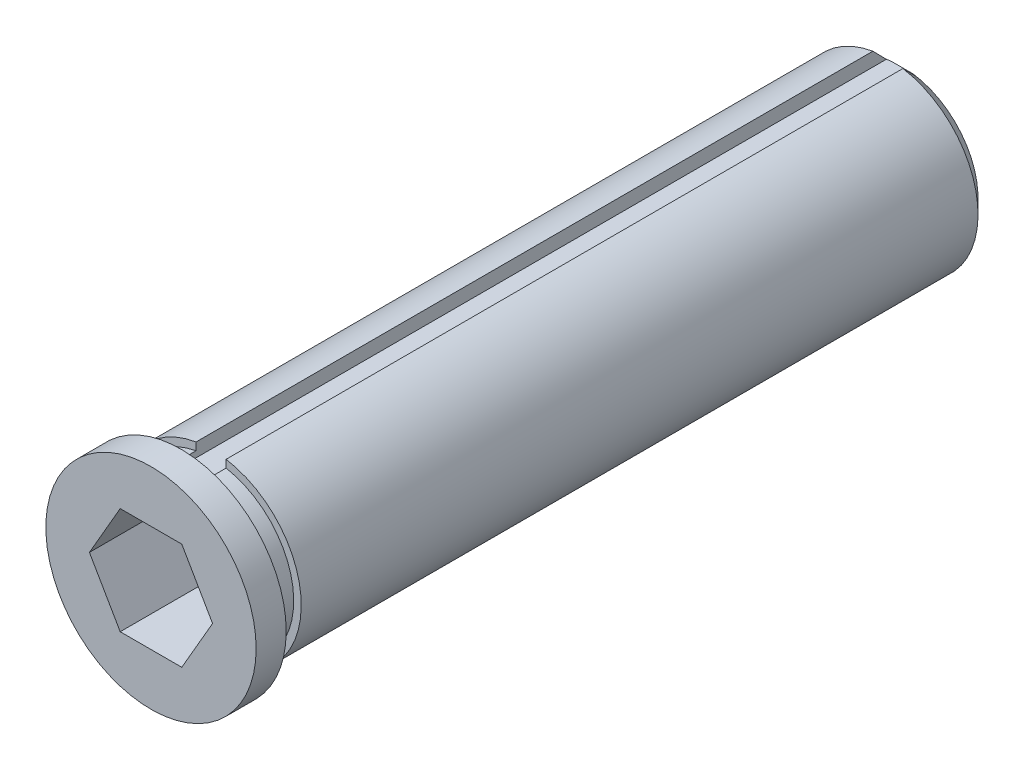
ISO-10303-21;
HEADER;
FILE_DESCRIPTION(('STEP AP214'),'2;1');
FILE_NAME('part.step','',(''),(''),'','','');
FILE_SCHEMA(('AUTOMOTIVE_DESIGN { 1 0 10303 214 1 1 1 1 }'));
ENDSEC;
DATA;
#1=APPLICATION_CONTEXT('core data for automotive mechanical design processes');
#2=APPLICATION_PROTOCOL_DEFINITION('international standard','automotive_design',2000,#1);
#3=PRODUCT_CONTEXT('',#1,'mechanical');
#4=PRODUCT('Part','Part','',(#3));
#5=PRODUCT_RELATED_PRODUCT_CATEGORY('part','',(#4));
#6=PRODUCT_DEFINITION_FORMATION('','',#4);
#7=PRODUCT_DEFINITION_CONTEXT('part definition',#1,'design');
#8=PRODUCT_DEFINITION('design','',#6,#7);
#9=PRODUCT_DEFINITION_SHAPE('','',#8);
#10=(LENGTH_UNIT() NAMED_UNIT(*) SI_UNIT(.MILLI.,.METRE.));
#11=(NAMED_UNIT(*) PLANE_ANGLE_UNIT() SI_UNIT($,.RADIAN.));
#12=(NAMED_UNIT(*) SI_UNIT($,.STERADIAN.) SOLID_ANGLE_UNIT());
#13=UNCERTAINTY_MEASURE_WITH_UNIT(LENGTH_MEASURE(1.E-05),#10,'distance_accuracy_value','');
#14=(GEOMETRIC_REPRESENTATION_CONTEXT(3) GLOBAL_UNCERTAINTY_ASSIGNED_CONTEXT((#13)) GLOBAL_UNIT_ASSIGNED_CONTEXT((#10,
#11,#12)) REPRESENTATION_CONTEXT('',''));
#15=CARTESIAN_POINT('',(0.,0.,0.));
#16=DIRECTION('',(0.,0.,1.));
#17=DIRECTION('',(1.,0.,0.));
#18=AXIS2_PLACEMENT_3D('',#15,#16,#17);
#19=CARTESIAN_POINT('',(0.,0.,0.));
#20=DIRECTION('',(0.,0.,1.));
#21=DIRECTION('',(1.,0.,0.));
#22=AXIS2_PLACEMENT_3D('',#19,#20,#21);
#23=PLANE('',#22);
#24=DIRECTION('',(0.5,0.866025403784439,0.));
#25=VECTOR('',#24,1.);
#26=CARTESIAN_POINT('',(2.04959345562317,-3.55,0.));
#27=LINE('',#26,#25);
#28=CARTESIAN_POINT('',(2.04959345562317,-3.55,0.));
#29=VERTEX_POINT('',#28);
#30=CARTESIAN_POINT('',(4.09918691124634,0.,0.));
#31=VERTEX_POINT('',#30);
#32=EDGE_CURVE('E229',#29,#31,#27,.T.);
#33=ORIENTED_EDGE('',*,*,#32,.T.);
#34=DIRECTION('',(-0.5,0.866025403784439,0.));
#35=VECTOR('',#34,1.);
#36=CARTESIAN_POINT('',(4.09918691124634,0.,0.));
#37=LINE('',#36,#35);
#38=CARTESIAN_POINT('',(2.04959345562317,3.55,0.));
#39=VERTEX_POINT('',#38);
#40=EDGE_CURVE('E257',#31,#39,#37,.T.);
#41=ORIENTED_EDGE('',*,*,#40,.T.);
#42=DIRECTION('',(-1.,0.,0.));
#43=VECTOR('',#42,1.);
#44=CARTESIAN_POINT('',(2.04959345562317,3.55,0.));
#45=LINE('',#44,#43);
#46=CARTESIAN_POINT('',(-2.04959345562317,3.55,0.));
#47=VERTEX_POINT('',#46);
#48=EDGE_CURVE('E261',#39,#47,#45,.T.);
#49=ORIENTED_EDGE('',*,*,#48,.T.);
#50=DIRECTION('',(-0.5,-0.866025403784439,0.));
#51=VECTOR('',#50,1.);
#52=CARTESIAN_POINT('',(-2.04959345562317,3.55,0.));
#53=LINE('',#52,#51);
#54=CARTESIAN_POINT('',(-4.09918691124634,0.,0.));
#55=VERTEX_POINT('',#54);
#56=EDGE_CURVE('E265',#47,#55,#53,.T.);
#57=ORIENTED_EDGE('',*,*,#56,.T.);
#58=DIRECTION('',(0.5,-0.866025403784439,0.));
#59=VECTOR('',#58,1.);
#60=CARTESIAN_POINT('',(-4.09918691124634,0.,0.));
#61=LINE('',#60,#59);
#62=CARTESIAN_POINT('',(-2.04959345562317,-3.55,0.));
#63=VERTEX_POINT('',#62);
#64=EDGE_CURVE('E269',#55,#63,#61,.T.);
#65=ORIENTED_EDGE('',*,*,#64,.T.);
#66=DIRECTION('',(1.,0.,0.));
#67=VECTOR('',#66,1.);
#68=CARTESIAN_POINT('',(-2.04959345562317,-3.55,0.));
#69=LINE('',#68,#67);
#70=EDGE_CURVE('E238',#63,#29,#69,.T.);
#71=ORIENTED_EDGE('',*,*,#70,.T.);
#72=EDGE_LOOP('',(#33,#41,#49,#57,#65,#71));
#73=FACE_BOUND('',#72,.T.);
#74=CARTESIAN_POINT('',(0.,0.,0.));
#75=DIRECTION('',(0.,0.,1.));
#76=DIRECTION('',(1.,0.,0.));
#77=AXIS2_PLACEMENT_3D('',#74,#75,#76);
#78=CIRCLE('',#77,5.053);
#79=CARTESIAN_POINT('',(-0.729937668571788,5.,0.));
#80=VERTEX_POINT('',#79);
#81=CARTESIAN_POINT('',(0.729937668571798,5.,0.));
#82=VERTEX_POINT('',#81);
#83=EDGE_CURVE('E209',#80,#82,#78,.T.);
#84=ORIENTED_EDGE('',*,*,#83,.F.);
#85=DIRECTION('',(1.,0.,0.));
#86=VECTOR('',#85,1.);
#87=CARTESIAN_POINT('',(0.,5.,0.));
#88=LINE('',#87,#86);
#89=EDGE_CURVE('E205',#80,#82,#88,.T.);
#90=ORIENTED_EDGE('',*,*,#89,.T.);
#91=EDGE_LOOP('',(#84,#90));
#92=FACE_BOUND('',#91,.T.);
#93=ADVANCED_FACE('F52',(#73,#92),#23,.F.);
#94=CARTESIAN_POINT('',(0.,0.,50.));
#95=DIRECTION('',(0.,0.,-1.));
#96=DIRECTION('',(-1.,0.,0.));
#97=AXIS2_PLACEMENT_3D('',#94,#95,#96);
#98=CYLINDRICAL_SURFACE('',#97,6.);
#99=CARTESIAN_POINT('',(0.,0.,46.));
#100=DIRECTION('',(0.,0.,-1.));
#101=DIRECTION('',(-1.,0.,0.));
#102=AXIS2_PLACEMENT_3D('',#99,#100,#101);
#103=CIRCLE('',#102,6.);
#104=CARTESIAN_POINT('',(1.,5.91607978309962,46.));
#105=VERTEX_POINT('',#104);
#106=CARTESIAN_POINT('',(-1.,5.91607978309962,46.));
#107=VERTEX_POINT('',#106);
#108=EDGE_CURVE('E222',#105,#107,#103,.T.);
#109=ORIENTED_EDGE('',*,*,#108,.T.);
#110=DIRECTION('',(0.,0.,-1.));
#111=VECTOR('',#110,1.);
#112=CARTESIAN_POINT('',(-1.,5.91607978309962,50.));
#113=LINE('',#112,#111);
#114=CARTESIAN_POINT('',(-1.,5.91607978309962,0.94699999999999));
#115=VERTEX_POINT('',#114);
#116=EDGE_CURVE('E195',#107,#115,#113,.T.);
#117=ORIENTED_EDGE('',*,*,#116,.T.);
#118=CARTESIAN_POINT('',(0.,0.,0.94699999999999));
#119=DIRECTION('',(0.,0.,1.));
#120=DIRECTION('',(1.,0.,0.));
#121=AXIS2_PLACEMENT_3D('',#118,#119,#120);
#122=CIRCLE('',#121,6.);
#123=CARTESIAN_POINT('',(1.,5.91607978309962,0.94699999999999));
#124=VERTEX_POINT('',#123);
#125=EDGE_CURVE('E213',#115,#124,#122,.T.);
#126=ORIENTED_EDGE('',*,*,#125,.T.);
#127=DIRECTION('',(0.,0.,-1.));
#128=VECTOR('',#127,1.);
#129=CARTESIAN_POINT('',(1.,5.91607978309962,50.));
#130=LINE('',#129,#128);
#131=EDGE_CURVE('E75',#105,#124,#130,.T.);
#132=ORIENTED_EDGE('',*,*,#131,.F.);
#133=EDGE_LOOP('',(#109,#117,#126,#132));
#134=FACE_BOUND('',#133,.T.);
#135=ADVANCED_FACE('F54',(#134),#98,.T.);
#136=CARTESIAN_POINT('',(0.,0.,50.));
#137=DIRECTION('',(0.,0.,1.));
#138=DIRECTION('',(1.,0.,0.));
#139=AXIS2_PLACEMENT_3D('',#136,#137,#138);
#140=PLANE('',#139);
#141=DIRECTION('',(-0.5,0.866025403784439,0.));
#142=VECTOR('',#141,1.);
#143=CARTESIAN_POINT('',(4.09918691124634,0.,50.));
#144=LINE('',#143,#142);
#145=CARTESIAN_POINT('',(4.09918691124634,0.,50.));
#146=VERTEX_POINT('',#145);
#147=CARTESIAN_POINT('',(2.04959345562317,3.55,50.));
#148=VERTEX_POINT('',#147);
#149=EDGE_CURVE('E237',#146,#148,#144,.T.);
#150=ORIENTED_EDGE('',*,*,#149,.F.);
#151=DIRECTION('',(0.5,0.866025403784439,0.));
#152=VECTOR('',#151,1.);
#153=CARTESIAN_POINT('',(2.04959345562317,-3.55,50.));
#154=LINE('',#153,#152);
#155=CARTESIAN_POINT('',(2.04959345562317,-3.55,50.));
#156=VERTEX_POINT('',#155);
#157=EDGE_CURVE('E234',#156,#146,#154,.T.);
#158=ORIENTED_EDGE('',*,*,#157,.F.);
#159=DIRECTION('',(1.,0.,0.));
#160=VECTOR('',#159,1.);
#161=CARTESIAN_POINT('',(-2.04959345562317,-3.55,50.));
#162=LINE('',#161,#160);
#163=CARTESIAN_POINT('',(-2.04959345562317,-3.55,50.));
#164=VERTEX_POINT('',#163);
#165=EDGE_CURVE('E250',#164,#156,#162,.T.);
#166=ORIENTED_EDGE('',*,*,#165,.F.);
#167=DIRECTION('',(0.5,-0.866025403784439,0.));
#168=VECTOR('',#167,1.);
#169=CARTESIAN_POINT('',(-4.09918691124634,0.,50.));
#170=LINE('',#169,#168);
#171=CARTESIAN_POINT('',(-4.09918691124634,0.,50.));
#172=VERTEX_POINT('',#171);
#173=EDGE_CURVE('E247',#172,#164,#170,.T.);
#174=ORIENTED_EDGE('',*,*,#173,.F.);
#175=DIRECTION('',(-0.5,-0.866025403784439,0.));
#176=VECTOR('',#175,1.);
#177=CARTESIAN_POINT('',(-2.04959345562317,3.55,50.));
#178=LINE('',#177,#176);
#179=CARTESIAN_POINT('',(-2.04959345562317,3.55,50.));
#180=VERTEX_POINT('',#179);
#181=EDGE_CURVE('E244',#180,#172,#178,.T.);
#182=ORIENTED_EDGE('',*,*,#181,.F.);
#183=DIRECTION('',(-1.,0.,0.));
#184=VECTOR('',#183,1.);
#185=CARTESIAN_POINT('',(2.04959345562317,3.55,50.));
#186=LINE('',#185,#184);
#187=EDGE_CURVE('E241',#148,#180,#186,.T.);
#188=ORIENTED_EDGE('',*,*,#187,.F.);
#189=EDGE_LOOP('',(#150,#158,#166,#174,#182,#188));
#190=FACE_BOUND('',#189,.T.);
#191=CARTESIAN_POINT('',(0.,0.,50.));
#192=DIRECTION('',(0.,0.,1.));
#193=DIRECTION('',(1.,0.,0.));
#194=AXIS2_PLACEMENT_3D('',#191,#192,#193);
#195=CIRCLE('',#194,7.);
#196=CARTESIAN_POINT('',(7.,0.,50.));
#197=VERTEX_POINT('',#196);
#198=EDGE_CURVE('E230',#197,#197,#195,.T.);
#199=ORIENTED_EDGE('',*,*,#198,.T.);
#200=EDGE_LOOP('',(#199));
#201=FACE_BOUND('',#200,.T.);
#202=ADVANCED_FACE('F331',(#190,#201),#140,.T.);
#203=CARTESIAN_POINT('',(2.04959345562317,-3.55,50.));
#204=DIRECTION('',(-0.866025403784439,0.5,0.));
#205=DIRECTION('',(-0.5,-0.866025403784439,0.));
#206=AXIS2_PLACEMENT_3D('',#203,#204,#205);
#207=PLANE('',#206);
#208=ORIENTED_EDGE('',*,*,#32,.F.);
#209=DIRECTION('',(0.,0.,-1.));
#210=VECTOR('',#209,1.);
#211=CARTESIAN_POINT('',(2.04959345562317,-3.55,50.));
#212=LINE('',#211,#210);
#213=EDGE_CURVE('E253',#156,#29,#212,.T.);
#214=ORIENTED_EDGE('',*,*,#213,.F.);
#215=ORIENTED_EDGE('',*,*,#157,.T.);
#216=DIRECTION('',(0.,0.,-1.));
#217=VECTOR('',#216,1.);
#218=CARTESIAN_POINT('',(4.09918691124634,0.,50.));
#219=LINE('',#218,#217);
#220=EDGE_CURVE('E290',#146,#31,#219,.T.);
#221=ORIENTED_EDGE('',*,*,#220,.T.);
#222=EDGE_LOOP('',(#208,#214,#215,#221));
#223=FACE_BOUND('',#222,.T.);
#224=ADVANCED_FACE('F337',(#223),#207,.T.);
#225=CARTESIAN_POINT('',(4.09918691124634,0.,50.));
#226=DIRECTION('',(-0.866025403784439,-0.5,0.));
#227=DIRECTION('',(0.5,-0.866025403784439,0.));
#228=AXIS2_PLACEMENT_3D('',#225,#226,#227);
#229=PLANE('',#228);
#230=ORIENTED_EDGE('',*,*,#40,.F.);
#231=ORIENTED_EDGE('',*,*,#220,.F.);
#232=ORIENTED_EDGE('',*,*,#149,.T.);
#233=DIRECTION('',(0.,0.,-1.));
#234=VECTOR('',#233,1.);
#235=CARTESIAN_POINT('',(2.04959345562317,3.55,50.));
#236=LINE('',#235,#234);
#237=EDGE_CURVE('E287',#148,#39,#236,.T.);
#238=ORIENTED_EDGE('',*,*,#237,.T.);
#239=EDGE_LOOP('',(#230,#231,#232,#238));
#240=FACE_BOUND('',#239,.T.);
#241=ADVANCED_FACE('F341',(#240),#229,.T.);
#242=CARTESIAN_POINT('',(2.04959345562317,3.55,50.));
#243=DIRECTION('',(0.,-1.,0.));
#244=DIRECTION('',(0.,0.,-1.));
#245=AXIS2_PLACEMENT_3D('',#242,#243,#244);
#246=PLANE('',#245);
#247=ORIENTED_EDGE('',*,*,#48,.F.);
#248=ORIENTED_EDGE('',*,*,#237,.F.);
#249=ORIENTED_EDGE('',*,*,#187,.T.);
#250=DIRECTION('',(0.,0.,-1.));
#251=VECTOR('',#250,1.);
#252=CARTESIAN_POINT('',(-2.04959345562317,3.55,50.));
#253=LINE('',#252,#251);
#254=EDGE_CURVE('E284',#180,#47,#253,.T.);
#255=ORIENTED_EDGE('',*,*,#254,.T.);
#256=EDGE_LOOP('',(#247,#248,#249,#255));
#257=FACE_BOUND('',#256,.T.);
#258=ADVANCED_FACE('F345',(#257),#246,.T.);
#259=CARTESIAN_POINT('',(-2.04959345562317,3.55,50.));
#260=DIRECTION('',(0.866025403784439,-0.5,0.));
#261=DIRECTION('',(0.5,0.866025403784439,0.));
#262=AXIS2_PLACEMENT_3D('',#259,#260,#261);
#263=PLANE('',#262);
#264=ORIENTED_EDGE('',*,*,#56,.F.);
#265=ORIENTED_EDGE('',*,*,#254,.F.);
#266=ORIENTED_EDGE('',*,*,#181,.T.);
#267=DIRECTION('',(0.,0.,-1.));
#268=VECTOR('',#267,1.);
#269=CARTESIAN_POINT('',(-4.09918691124634,0.,50.));
#270=LINE('',#269,#268);
#271=EDGE_CURVE('E281',#172,#55,#270,.T.);
#272=ORIENTED_EDGE('',*,*,#271,.T.);
#273=EDGE_LOOP('',(#264,#265,#266,#272));
#274=FACE_BOUND('',#273,.T.);
#275=ADVANCED_FACE('F349',(#274),#263,.T.);
#276=CARTESIAN_POINT('',(-4.09918691124634,0.,50.));
#277=DIRECTION('',(0.866025403784439,0.5,0.));
#278=DIRECTION('',(-0.5,0.866025403784439,0.));
#279=AXIS2_PLACEMENT_3D('',#276,#277,#278);
#280=PLANE('',#279);
#281=ORIENTED_EDGE('',*,*,#64,.F.);
#282=ORIENTED_EDGE('',*,*,#271,.F.);
#283=ORIENTED_EDGE('',*,*,#173,.T.);
#284=DIRECTION('',(0.,0.,-1.));
#285=VECTOR('',#284,1.);
#286=CARTESIAN_POINT('',(-2.04959345562317,-3.55,50.));
#287=LINE('',#286,#285);
#288=EDGE_CURVE('E83',#164,#63,#287,.T.);
#289=ORIENTED_EDGE('',*,*,#288,.T.);
#290=EDGE_LOOP('',(#281,#282,#283,#289));
#291=FACE_BOUND('',#290,.T.);
#292=ADVANCED_FACE('F353',(#291),#280,.T.);
#293=CARTESIAN_POINT('',(-2.04959345562317,-3.55,50.));
#294=DIRECTION('',(0.,1.,0.));
#295=DIRECTION('',(-1.,0.,0.));
#296=AXIS2_PLACEMENT_3D('',#293,#294,#295);
#297=PLANE('',#296);
#298=ORIENTED_EDGE('',*,*,#70,.F.);
#299=ORIENTED_EDGE('',*,*,#288,.F.);
#300=ORIENTED_EDGE('',*,*,#165,.T.);
#301=ORIENTED_EDGE('',*,*,#213,.T.);
#302=EDGE_LOOP('',(#298,#299,#300,#301));
#303=FACE_BOUND('',#302,.T.);
#304=ADVANCED_FACE('F357',(#303),#297,.T.);
#305=CARTESIAN_POINT('',(0.,0.,48.));
#306=DIRECTION('',(0.,0.,1.));
#307=DIRECTION('',(1.,0.,0.));
#308=AXIS2_PLACEMENT_3D('',#305,#306,#307);
#309=CYLINDRICAL_SURFACE('',#308,7.);
#310=CARTESIAN_POINT('',(0.,0.,48.));
#311=DIRECTION('',(0.,0.,1.));
#312=DIRECTION('',(1.,0.,0.));
#313=AXIS2_PLACEMENT_3D('',#310,#311,#312);
#314=CIRCLE('',#313,7.);
#315=CARTESIAN_POINT('',(7.,0.,48.));
#316=VERTEX_POINT('',#315);
#317=EDGE_CURVE('E225',#316,#316,#314,.T.);
#318=ORIENTED_EDGE('',*,*,#317,.T.);
#319=EDGE_LOOP('',(#318));
#320=FACE_BOUND('',#319,.T.);
#321=ORIENTED_EDGE('',*,*,#198,.F.);
#322=EDGE_LOOP('',(#321));
#323=FACE_BOUND('',#322,.T.);
#324=ADVANCED_FACE('F361',(#320,#323),#309,.T.);
#325=CARTESIAN_POINT('',(0.,0.,48.));
#326=DIRECTION('',(0.,0.,1.));
#327=DIRECTION('',(1.,0.,0.));
#328=AXIS2_PLACEMENT_3D('',#325,#326,#327);
#329=PLANE('',#328);
#330=DIRECTION('',(0.,1.,0.));
#331=VECTOR('',#330,1.);
#332=CARTESIAN_POINT('',(-1.,5.,48.));
#333=LINE('',#332,#331);
#334=CARTESIAN_POINT('',(-1.,5.,48.));
#335=VERTEX_POINT('',#334);
#336=CARTESIAN_POINT('',(-1.,5.40832691319599,48.));
#337=VERTEX_POINT('',#336);
#338=EDGE_CURVE('E155',#335,#337,#333,.T.);
#339=ORIENTED_EDGE('',*,*,#338,.T.);
#340=CARTESIAN_POINT('',(0.,0.,48.));
#341=DIRECTION('',(0.,0.,-1.));
#342=DIRECTION('',(-1.,0.,0.));
#343=AXIS2_PLACEMENT_3D('',#340,#341,#342);
#344=CIRCLE('',#343,5.5);
#345=CARTESIAN_POINT('',(1.,5.40832691319599,48.));
#346=VERTEX_POINT('',#345);
#347=EDGE_CURVE('E217',#346,#337,#344,.T.);
#348=ORIENTED_EDGE('',*,*,#347,.F.);
#349=DIRECTION('',(0.,1.,0.));
#350=VECTOR('',#349,1.);
#351=CARTESIAN_POINT('',(1.,5.,48.));
#352=LINE('',#351,#350);
#353=CARTESIAN_POINT('',(1.,5.,48.));
#354=VERTEX_POINT('',#353);
#355=EDGE_CURVE('E178',#354,#346,#352,.T.);
#356=ORIENTED_EDGE('',*,*,#355,.F.);
#357=DIRECTION('',(-1.,0.,0.));
#358=VECTOR('',#357,1.);
#359=CARTESIAN_POINT('',(1.,5.,48.));
#360=LINE('',#359,#358);
#361=EDGE_CURVE('E172',#354,#335,#360,.T.);
#362=ORIENTED_EDGE('',*,*,#361,.T.);
#363=EDGE_LOOP('',(#339,#348,#356,#362));
#364=FACE_BOUND('',#363,.T.);
#365=ORIENTED_EDGE('',*,*,#317,.F.);
#366=EDGE_LOOP('',(#365));
#367=FACE_BOUND('',#366,.T.);
#368=ADVANCED_FACE('F176',(#364,#367),#329,.F.);
#369=CARTESIAN_POINT('',(0.,0.,46.));
#370=DIRECTION('',(0.,0.,-1.));
#371=DIRECTION('',(-1.,0.,0.));
#372=AXIS2_PLACEMENT_3D('',#369,#370,#371);
#373=PLANE('',#372);
#374=CARTESIAN_POINT('',(0.,0.,46.));
#375=DIRECTION('',(0.,0.,-1.));
#376=DIRECTION('',(-1.,0.,0.));
#377=AXIS2_PLACEMENT_3D('',#374,#375,#376);
#378=CIRCLE('',#377,5.5);
#379=CARTESIAN_POINT('',(1.,5.40832691319599,46.));
#380=VERTEX_POINT('',#379);
#381=CARTESIAN_POINT('',(-1.,5.40832691319599,46.));
#382=VERTEX_POINT('',#381);
#383=EDGE_CURVE('E218',#380,#382,#378,.T.);
#384=ORIENTED_EDGE('',*,*,#383,.T.);
#385=DIRECTION('',(0.,1.,0.));
#386=VECTOR('',#385,1.);
#387=CARTESIAN_POINT('',(-1.,0.,46.));
#388=LINE('',#387,#386);
#389=EDGE_CURVE('E199',#382,#107,#388,.T.);
#390=ORIENTED_EDGE('',*,*,#389,.T.);
#391=ORIENTED_EDGE('',*,*,#108,.F.);
#392=DIRECTION('',(0.,1.,0.));
#393=VECTOR('',#392,1.);
#394=CARTESIAN_POINT('',(1.,0.,46.));
#395=LINE('',#394,#393);
#396=EDGE_CURVE('E189',#380,#105,#395,.T.);
#397=ORIENTED_EDGE('',*,*,#396,.F.);
#398=EDGE_LOOP('',(#384,#390,#391,#397));
#399=FACE_BOUND('',#398,.T.);
#400=ADVANCED_FACE('F366',(#399),#373,.F.);
#401=CARTESIAN_POINT('',(0.,0.,46.));
#402=DIRECTION('',(0.,0.,1.));
#403=DIRECTION('',(1.,0.,0.));
#404=AXIS2_PLACEMENT_3D('',#401,#402,#403);
#405=CYLINDRICAL_SURFACE('',#404,5.5);
#406=ORIENTED_EDGE('',*,*,#347,.T.);
#407=DIRECTION('',(0.,0.,1.));
#408=VECTOR('',#407,1.);
#409=CARTESIAN_POINT('',(-1.,5.40832691319599,46.));
#410=LINE('',#409,#408);
#411=EDGE_CURVE('E161',#337,#382,#410,.F.);
#412=ORIENTED_EDGE('',*,*,#411,.T.);
#413=ORIENTED_EDGE('',*,*,#383,.F.);
#414=DIRECTION('',(0.,0.,1.));
#415=VECTOR('',#414,1.);
#416=CARTESIAN_POINT('',(1.,5.40832691319599,46.));
#417=LINE('',#416,#415);
#418=EDGE_CURVE('E192',#346,#380,#417,.F.);
#419=ORIENTED_EDGE('',*,*,#418,.F.);
#420=EDGE_LOOP('',(#406,#412,#413,#419));
#421=FACE_BOUND('',#420,.T.);
#422=ADVANCED_FACE('F322',(#421),#405,.T.);
#423=CARTESIAN_POINT('',(0.,0.,0.));
#424=DIRECTION('',(0.,0.,1.));
#425=DIRECTION('',(1.,0.,0.));
#426=AXIS2_PLACEMENT_3D('',#423,#424,#425);
#427=CONICAL_SURFACE('',#426,5.053,0.785398163397453);
#428=CARTESIAN_POINT('',(-1.,7.30935856529961,2.32444689144683));
#429=CARTESIAN_POINT('',(-1.,7.00348637612789,2.02144567813717));
#430=CARTESIAN_POINT('',(-1.,6.6974831359208,1.71857563696572));
#431=CARTESIAN_POINT('',(-1.,6.08494920005565,1.11337537523354));
#432=CARTESIAN_POINT('',(-1.,5.77841850943123,0.811045149576648));
#433=CARTESIAN_POINT('',(-1.,5.31802209540286,0.358157060979849));
#434=CARTESIAN_POINT('',(-1.,5.16445584691026,0.20729487431393));
#435=CARTESIAN_POINT('',(-1.,4.85705815893909,-0.0941587577238393));
#436=CARTESIAN_POINT('',(-1.,4.70322671977027,-0.244750203411514));
#437=CARTESIAN_POINT('',(-1.,4.39521705318946,-0.545581324096704));
#438=CARTESIAN_POINT('',(-1.,4.24103882243556,-0.695820995675571));
#439=CARTESIAN_POINT('',(-1.,3.93219584579086,-0.995800539947926));
#440=CARTESIAN_POINT('',(-1.,3.77753109793595,-1.14554041061864));
#441=CARTESIAN_POINT('',(-1.,3.62255310855317,-1.29495648983568));
#442=B_SPLINE_CURVE_WITH_KNOTS('',3,(#428,#429,#430,#431,#432,#433,#434,#435,#436,#437,#438,
#439,#440,#441),.UNSPECIFIED.,.F.,.F.,(4,2,2,2,2,2,4),(0.,1.29163113840812,2.58325001796036,
3.22906545256189,3.87488013331893,4.52070106446589,5.16652460619149),.UNSPECIFIED.);
#443=CARTESIAN_POINT('',(-1.,5.,0.0460195135927827));
#444=VERTEX_POINT('',#443);
#445=EDGE_CURVE('E56',#115,#444,#442,.T.);
#446=ORIENTED_EDGE('',*,*,#445,.T.);
#447=CARTESIAN_POINT('',(-1.0007,5.,0.0461568410865709));
#448=CARTESIAN_POINT('',(-0.875991359600107,5.,0.0216257719916779));
#449=CARTESIAN_POINT('',(-0.75039336419543,5.,0.00142961602236691));
#450=CARTESIAN_POINT('',(-0.498011708149157,5.,-0.0298051266104958));
#451=CARTESIAN_POINT('',(-0.371227542115643,5.,-0.0408396115721098));
#452=CARTESIAN_POINT('',(-0.11898619159019,5.,-0.0531522313454377));
#453=CARTESIAN_POINT('',(0.00646421584811084,5.,-0.0545669112356931));
#454=CARTESIAN_POINT('',(0.257058183647761,5.,-0.047961489411532));
#455=CARTESIAN_POINT('',(0.382201864489696,5.,-0.0399460230386922));
#456=CARTESIAN_POINT('',(0.589496264580508,5.,-0.019041560408544));
#457=CARTESIAN_POINT('',(0.671915629300933,5.,-0.00870712503206821));
#458=CARTESIAN_POINT('',(0.836579239880454,5.,0.0158449397357768));
#459=CARTESIAN_POINT('',(0.918820750991549,5.,0.0300809516874706));
#460=CARTESIAN_POINT('',(1.0007,5.,0.0461568410865712));
#461=B_SPLINE_CURVE_WITH_KNOTS('',3,(#447,#448,#449,#450,#451,#452,#453,#454,#455,#456,#457,
#458,#459,#460),.UNSPECIFIED.,.F.,.F.,(4,2,2,2,2,2,4),(0.,0.381274357146306,0.762719319827261,
1.13873847705856,1.51457288113649,1.7636826043471,2.01398682544234),.UNSPECIFIED.);
#462=EDGE_CURVE('E12',#444,#80,#461,.T.);
#463=ORIENTED_EDGE('',*,*,#462,.T.);
#464=ORIENTED_EDGE('',*,*,#83,.T.);
#465=CARTESIAN_POINT('',(1.,5.,0.0460195135927827));
#466=VERTEX_POINT('',#465);
#467=EDGE_CURVE('E68',#82,#466,#461,.T.);
#468=ORIENTED_EDGE('',*,*,#467,.T.);
#469=CARTESIAN_POINT('',(1.,7.30935856529961,2.32444689144683));
#470=CARTESIAN_POINT('',(1.,7.00348637612789,2.02144567813717));
#471=CARTESIAN_POINT('',(1.,6.6974831359208,1.71857563696572));
#472=CARTESIAN_POINT('',(1.,6.08494920005565,1.11337537523354));
#473=CARTESIAN_POINT('',(1.,5.77841850943123,0.811045149576648));
#474=CARTESIAN_POINT('',(1.,5.31802209540286,0.358157060979849));
#475=CARTESIAN_POINT('',(1.,5.16445584691026,0.20729487431393));
#476=CARTESIAN_POINT('',(1.,4.85705815893909,-0.0941587577238393));
#477=CARTESIAN_POINT('',(1.,4.70322671977027,-0.244750203411514));
#478=CARTESIAN_POINT('',(1.,4.39521705318946,-0.545581324096704));
#479=CARTESIAN_POINT('',(1.,4.24103882243556,-0.695820995675571));
#480=CARTESIAN_POINT('',(1.,3.93219584579086,-0.995800539947926));
#481=CARTESIAN_POINT('',(1.,3.77753109793595,-1.14554041061864));
#482=CARTESIAN_POINT('',(1.,3.62255310855317,-1.29495648983568));
#483=B_SPLINE_CURVE_WITH_KNOTS('',3,(#469,#470,#471,#472,#473,#474,#475,#476,#477,#478,#479,
#480,#481,#482),.UNSPECIFIED.,.F.,.F.,(4,2,2,2,2,2,4),(0.,1.29163113840812,2.58325001796036,
3.22906545256189,3.87488013331893,4.52070106446589,5.16652460619149),.UNSPECIFIED.);
#484=EDGE_CURVE('E294',#124,#466,#483,.T.);
#485=ORIENTED_EDGE('',*,*,#484,.F.);
#486=ORIENTED_EDGE('',*,*,#125,.F.);
#487=EDGE_LOOP('',(#446,#463,#464,#468,#485,#486));
#488=FACE_BOUND('',#487,.T.);
#489=ADVANCED_FACE('F309',(#488),#427,.T.);
#490=CARTESIAN_POINT('',(1.,5.,50.2360679774998));
#491=DIRECTION('',(0.,-1.,0.));
#492=DIRECTION('',(0.,0.,-1.));
#493=AXIS2_PLACEMENT_3D('',#490,#491,#492);
#494=PLANE('',#493);
#495=DIRECTION('',(0.,0.,-1.));
#496=VECTOR('',#495,1.);
#497=CARTESIAN_POINT('',(-1.,5.,50.2360679774998));
#498=LINE('',#497,#496);
#499=EDGE_CURVE('E158',#335,#444,#498,.T.);
#500=ORIENTED_EDGE('',*,*,#499,.F.);
#501=ORIENTED_EDGE('',*,*,#361,.F.);
#502=DIRECTION('',(0.,0.,-1.));
#503=VECTOR('',#502,1.);
#504=CARTESIAN_POINT('',(1.,5.,50.2360679774998));
#505=LINE('',#504,#503);
#506=EDGE_CURVE('E167',#354,#466,#505,.T.);
#507=ORIENTED_EDGE('',*,*,#506,.T.);
#508=ORIENTED_EDGE('',*,*,#467,.F.);
#509=ORIENTED_EDGE('',*,*,#89,.F.);
#510=ORIENTED_EDGE('',*,*,#462,.F.);
#511=EDGE_LOOP('',(#500,#501,#507,#508,#509,#510));
#512=FACE_BOUND('',#511,.T.);
#513=ADVANCED_FACE('F170',(#512),#494,.F.);
#514=CARTESIAN_POINT('',(-1.,5.,50.2360679774998));
#515=DIRECTION('',(-1.,0.,0.));
#516=DIRECTION('',(0.,0.,1.));
#517=AXIS2_PLACEMENT_3D('',#514,#515,#516);
#518=PLANE('',#517);
#519=ORIENTED_EDGE('',*,*,#338,.F.);
#520=ORIENTED_EDGE('',*,*,#499,.T.);
#521=ORIENTED_EDGE('',*,*,#445,.F.);
#522=ORIENTED_EDGE('',*,*,#116,.F.);
#523=ORIENTED_EDGE('',*,*,#389,.F.);
#524=ORIENTED_EDGE('',*,*,#411,.F.);
#525=EDGE_LOOP('',(#519,#520,#521,#522,#523,#524));
#526=FACE_BOUND('',#525,.T.);
#527=ADVANCED_FACE('F157',(#526),#518,.F.);
#528=CARTESIAN_POINT('',(1.,5.,50.2360679774998));
#529=DIRECTION('',(-1.,0.,0.));
#530=DIRECTION('',(0.,0.,1.));
#531=AXIS2_PLACEMENT_3D('',#528,#529,#530);
#532=PLANE('',#531);
#533=ORIENTED_EDGE('',*,*,#418,.T.);
#534=ORIENTED_EDGE('',*,*,#396,.T.);
#535=ORIENTED_EDGE('',*,*,#131,.T.);
#536=ORIENTED_EDGE('',*,*,#484,.T.);
#537=ORIENTED_EDGE('',*,*,#506,.F.);
#538=ORIENTED_EDGE('',*,*,#355,.T.);
#539=EDGE_LOOP('',(#533,#534,#535,#536,#537,#538));
#540=FACE_BOUND('',#539,.T.);
#541=ADVANCED_FACE('F312',(#540),#532,.T.);
#542=CLOSED_SHELL('',(#93,#135,#202,#224,#241,#258,#275,#292,#304,#324,#368,#400,#422,#489,#513,
#527,#541));
#543=MANIFOLD_SOLID_BREP('B2',#542);
#544=ADVANCED_BREP_SHAPE_REPRESENTATION('',(#18,#543),#14);
#545=SHAPE_DEFINITION_REPRESENTATION(#9,#544);
ENDSEC;
END-ISO-10303-21;
